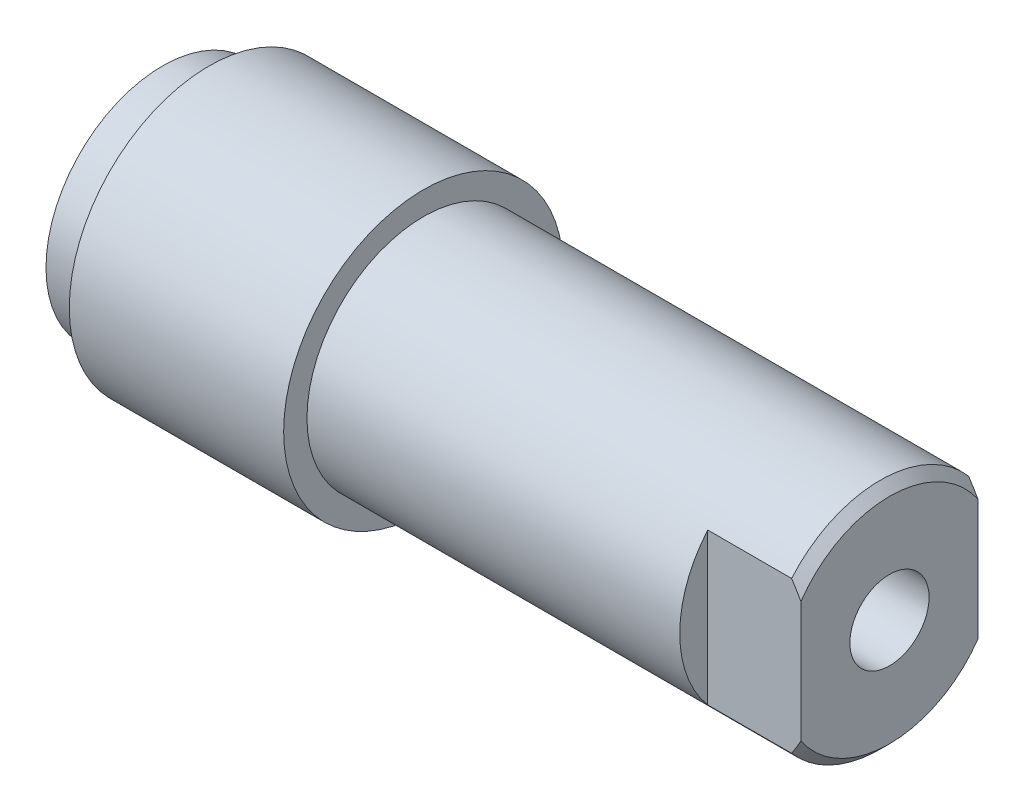
ISO-10303-21;
HEADER;
FILE_DESCRIPTION(('STEP AP214'),'2;1');
FILE_NAME('part.step','',(''),(''),'','','');
FILE_SCHEMA(('AUTOMOTIVE_DESIGN { 1 0 10303 214 1 1 1 1 }'));
ENDSEC;
DATA;
#1=APPLICATION_CONTEXT('core data for automotive mechanical design processes');
#2=APPLICATION_PROTOCOL_DEFINITION('international standard','automotive_design',2000,#1);
#3=PRODUCT_CONTEXT('',#1,'mechanical');
#4=PRODUCT('Part','Part','',(#3));
#5=PRODUCT_RELATED_PRODUCT_CATEGORY('part','',(#4));
#6=PRODUCT_DEFINITION_FORMATION('','',#4);
#7=PRODUCT_DEFINITION_CONTEXT('part definition',#1,'design');
#8=PRODUCT_DEFINITION('design','',#6,#7);
#9=PRODUCT_DEFINITION_SHAPE('','',#8);
#10=(LENGTH_UNIT() NAMED_UNIT(*) SI_UNIT(.MILLI.,.METRE.));
#11=(NAMED_UNIT(*) PLANE_ANGLE_UNIT() SI_UNIT($,.RADIAN.));
#12=(NAMED_UNIT(*) SI_UNIT($,.STERADIAN.) SOLID_ANGLE_UNIT());
#13=UNCERTAINTY_MEASURE_WITH_UNIT(LENGTH_MEASURE(1.E-05),#10,'distance_accuracy_value','');
#14=(GEOMETRIC_REPRESENTATION_CONTEXT(3) GLOBAL_UNCERTAINTY_ASSIGNED_CONTEXT((#13)) GLOBAL_UNIT_ASSIGNED_CONTEXT((#10,
#11,#12)) REPRESENTATION_CONTEXT('',''));
#15=CARTESIAN_POINT('',(0.,0.,0.));
#16=DIRECTION('',(0.,0.,1.));
#17=DIRECTION('',(1.,0.,0.));
#18=AXIS2_PLACEMENT_3D('',#15,#16,#17);
#19=CARTESIAN_POINT('',(0.,0.,0.));
#20=DIRECTION('',(-1.,0.,0.));
#21=DIRECTION('',(0.,0.,1.));
#22=AXIS2_PLACEMENT_3D('',#19,#20,#21);
#23=CONICAL_SURFACE('',#22,11.5,0.785398163397448);
#24=CARTESIAN_POINT('',(-1.,0.,0.));
#25=DIRECTION('',(-1.,0.,0.));
#26=DIRECTION('',(0.,0.,1.));
#27=AXIS2_PLACEMENT_3D('',#24,#25,#26);
#28=CIRCLE('',#27,12.5);
#29=CARTESIAN_POINT('',(-1.,-8.12403840463596,-9.5));
#30=VERTEX_POINT('',#29);
#31=CARTESIAN_POINT('',(-1.,-8.12403840463596,9.5));
#32=VERTEX_POINT('',#31);
#33=EDGE_CURVE('E112',#30,#32,#28,.T.);
#34=ORIENTED_EDGE('',*,*,#33,.F.);
#35=CARTESIAN_POINT('',(-1.0007,-8.12511541394952,-9.5));
#36=CARTESIAN_POINT('',(-0.873194561551899,-7.9289117454699,-9.5));
#37=CARTESIAN_POINT('',(-0.747526482821213,-7.73149513637505,-9.5));
#38=CARTESIAN_POINT('',(-0.500498397846567,-7.33391925222832,-9.5));
#39=CARTESIAN_POINT('',(-0.379139477254392,-7.13375930337704,-9.5));
#40=CARTESIAN_POINT('',(-0.140850162617151,-6.72949835661232,-9.5));
#41=CARTESIAN_POINT('',(-0.0239441445559193,-6.52538293756249,-9.5));
#42=CARTESIAN_POINT('',(0.203967032279799,-6.11389534110116,-9.5));
#43=CARTESIAN_POINT('',(0.314972569437841,-5.9065233736317,-9.5));
#44=CARTESIAN_POINT('',(0.532990035141959,-5.48262863158564,-9.5));
#45=CARTESIAN_POINT('',(0.639815908636657,-5.26600942041289,-9.5));
#46=CARTESIAN_POINT('',(0.844960390996271,-4.82878383550617,-9.5));
#47=CARTESIAN_POINT('',(0.943278188873506,-4.60817708409836,-9.5));
#48=CARTESIAN_POINT('',(1.22297714469007,-3.94082587123786,-9.5));
#49=CARTESIAN_POINT('',(1.38960707909409,-3.48759817726118,-9.5));
#50=CARTESIAN_POINT('',(1.61476461376648,-2.74577168286483,-9.5));
#51=CARTESIAN_POINT('',(1.69006843299933,-2.4622397074083,-9.5));
#52=CARTESIAN_POINT('',(1.81783779881872,-1.8899688668685,-9.5));
#53=CARTESIAN_POINT('',(1.87030280178218,-1.60122987801513,-9.5));
#54=CARTESIAN_POINT('',(1.94925725507413,-1.02351549135478,-9.5));
#55=CARTESIAN_POINT('',(1.97603480431458,-0.734579982475223,-9.5));
#56=CARTESIAN_POINT('',(2.00312967295379,-0.155467200349581,-9.5));
#57=CARTESIAN_POINT('',(2.00344879537636,0.134709986933968,-9.5));
#58=CARTESIAN_POINT('',(1.97760631301387,0.713974184103464,-9.5));
#59=CARTESIAN_POINT('',(1.95143452124533,1.00306073166355,-9.5));
#60=CARTESIAN_POINT('',(1.87407524049517,1.57784529406505,-9.5));
#61=CARTESIAN_POINT('',(1.82288492233312,1.86354292193241,-9.5));
#62=CARTESIAN_POINT('',(1.69735979754209,2.4330693054564,-9.5));
#63=CARTESIAN_POINT('',(1.62277429072305,2.71684207719332,-9.5));
#64=CARTESIAN_POINT('',(1.45381362758855,3.27835174619045,-9.5));
#65=CARTESIAN_POINT('',(1.3594384425099,3.55608863467719,-9.5));
#66=CARTESIAN_POINT('',(1.11305399733529,4.21494576392924,-9.5));
#67=CARTESIAN_POINT('',(0.95307743206747,4.59307278528129,-9.5));
#68=CARTESIAN_POINT('',(0.608063087445193,5.33792394680765,-9.5));
#69=CARTESIAN_POINT('',(0.423003285871534,5.70463771469682,-9.5));
#70=CARTESIAN_POINT('',(0.133584879777872,6.24238388513473,-9.5));
#71=CARTESIAN_POINT('',(0.0364760843111557,6.41737991981025,-9.5));
#72=CARTESIAN_POINT('',(-0.161741379517749,6.76510448092926,-9.5));
#73=CARTESIAN_POINT('',(-0.262850188715233,6.93783292724824,-9.5));
#74=CARTESIAN_POINT('',(-0.468327562542131,7.28077451221489,-9.5));
#75=CARTESIAN_POINT('',(-0.572687799992644,7.45099265718999,-9.5));
#76=CARTESIAN_POINT('',(-0.784483675728173,7.78947329111204,-9.5));
#77=CARTESIAN_POINT('',(-0.891918883394734,7.9577360492957,-9.5));
#78=CARTESIAN_POINT('',(-1.0007,8.12511541394952,-9.5));
#79=B_SPLINE_CURVE_WITH_KNOTS('',3,(#35,#36,#37,#38,#39,#40,#41,#42,#43,#44,#45,#46,#47,#48,#49,
#50,#51,#52,#53,#54,#55,#56,#57,#58,#59,#60,#61,#62,#63,#64,#65,#66,#67,#68,#69,#70,#71,#72,#73,
#74,#75,#76,#77,#78),.UNSPECIFIED.,.F.,.F.,(4,2,2,2,2,2,2,2,2,2,2,2,2,2,2,2,2,2,2,2,2,4),(0.,
0.701997094411312,1.40416981327412,2.10975345072377,2.81529178607948,3.53968867966653,
4.2641545467044,5.70986391983337,6.58918463340871,7.4685262759539,8.33788614686162,
9.20718677472175,10.0768218159843,10.9465552213102,11.8259467587553,12.7053395743565,
13.9358121923581,15.1673722065296,15.7677344465392,16.3681178433696,16.9670729311215,
17.5659445477606),.UNSPECIFIED.);
#80=CARTESIAN_POINT('',(0.,-6.48074069840786,-9.5));
#81=VERTEX_POINT('',#80);
#82=EDGE_CURVE('E164',#30,#81,#79,.T.);
#83=ORIENTED_EDGE('',*,*,#82,.T.);
#84=CARTESIAN_POINT('',(0.,0.,0.));
#85=DIRECTION('',(-1.,0.,0.));
#86=DIRECTION('',(0.,0.,1.));
#87=AXIS2_PLACEMENT_3D('',#84,#85,#86);
#88=CIRCLE('',#87,11.5);
#89=CARTESIAN_POINT('',(0.,-6.48074069840786,9.5));
#90=VERTEX_POINT('',#89);
#91=EDGE_CURVE('E113',#81,#90,#88,.T.);
#92=ORIENTED_EDGE('',*,*,#91,.T.);
#93=CARTESIAN_POINT('',(-1.0007,8.12511541394952,9.5));
#94=CARTESIAN_POINT('',(-0.873194561551899,7.9289117454699,9.5));
#95=CARTESIAN_POINT('',(-0.747526482821213,7.73149513637505,9.5));
#96=CARTESIAN_POINT('',(-0.500498397846567,7.33391925222832,9.5));
#97=CARTESIAN_POINT('',(-0.379139477254392,7.13375930337704,9.5));
#98=CARTESIAN_POINT('',(-0.140850162617151,6.72949835661232,9.5));
#99=CARTESIAN_POINT('',(-0.0239441445559193,6.52538293756249,9.5));
#100=CARTESIAN_POINT('',(0.203967032279799,6.11389534110116,9.5));
#101=CARTESIAN_POINT('',(0.314972569437841,5.9065233736317,9.5));
#102=CARTESIAN_POINT('',(0.532990035141959,5.48262863158564,9.5));
#103=CARTESIAN_POINT('',(0.639815908636657,5.26600942041289,9.5));
#104=CARTESIAN_POINT('',(0.844960390996271,4.82878383550617,9.5));
#105=CARTESIAN_POINT('',(0.943278188873506,4.60817708409836,9.5));
#106=CARTESIAN_POINT('',(1.22297714469007,3.94082587123786,9.5));
#107=CARTESIAN_POINT('',(1.38960707909409,3.48759817726118,9.5));
#108=CARTESIAN_POINT('',(1.61476461376648,2.74577168286483,9.5));
#109=CARTESIAN_POINT('',(1.69006843299933,2.4622397074083,9.5));
#110=CARTESIAN_POINT('',(1.81783779881872,1.8899688668685,9.5));
#111=CARTESIAN_POINT('',(1.87030280178218,1.60122987801513,9.5));
#112=CARTESIAN_POINT('',(1.94925725507413,1.02351549135478,9.5));
#113=CARTESIAN_POINT('',(1.97603480431458,0.734579982475223,9.5));
#114=CARTESIAN_POINT('',(2.00312967295379,0.155467200349581,9.5));
#115=CARTESIAN_POINT('',(2.00344879537636,-0.134709986933968,9.5));
#116=CARTESIAN_POINT('',(1.97760631301387,-0.713974184103464,9.5));
#117=CARTESIAN_POINT('',(1.95143452124533,-1.00306073166355,9.5));
#118=CARTESIAN_POINT('',(1.87407524049517,-1.57784529406505,9.5));
#119=CARTESIAN_POINT('',(1.82288492233312,-1.86354292193241,9.5));
#120=CARTESIAN_POINT('',(1.69735979754209,-2.4330693054564,9.5));
#121=CARTESIAN_POINT('',(1.62277429072305,-2.71684207719332,9.5));
#122=CARTESIAN_POINT('',(1.45381362758855,-3.27835174619045,9.5));
#123=CARTESIAN_POINT('',(1.3594384425099,-3.55608863467719,9.5));
#124=CARTESIAN_POINT('',(1.11305399733529,-4.21494576392924,9.5));
#125=CARTESIAN_POINT('',(0.95307743206747,-4.59307278528129,9.5));
#126=CARTESIAN_POINT('',(0.608063087445193,-5.33792394680765,9.5));
#127=CARTESIAN_POINT('',(0.423003285871534,-5.70463771469682,9.5));
#128=CARTESIAN_POINT('',(0.133584879777872,-6.24238388513473,9.5));
#129=CARTESIAN_POINT('',(0.0364760843111557,-6.41737991981025,9.5));
#130=CARTESIAN_POINT('',(-0.161741379517749,-6.76510448092926,9.5));
#131=CARTESIAN_POINT('',(-0.262850188715233,-6.93783292724824,9.5));
#132=CARTESIAN_POINT('',(-0.468327562542131,-7.28077451221489,9.5));
#133=CARTESIAN_POINT('',(-0.572687799992644,-7.45099265718999,9.5));
#134=CARTESIAN_POINT('',(-0.784483675728173,-7.78947329111204,9.5));
#135=CARTESIAN_POINT('',(-0.891918883394734,-7.9577360492957,9.5));
#136=CARTESIAN_POINT('',(-1.0007,-8.12511541394952,9.5));
#137=B_SPLINE_CURVE_WITH_KNOTS('',3,(#93,#94,#95,#96,#97,#98,#99,#100,#101,#102,#103,#104,#105,
#106,#107,#108,#109,#110,#111,#112,#113,#114,#115,#116,#117,#118,#119,#120,#121,#122,#123,#124,
#125,#126,#127,#128,#129,#130,#131,#132,#133,#134,#135,#136),.UNSPECIFIED.,.F.,.F.,(4,2,2,2,2,2,
2,2,2,2,2,2,2,2,2,2,2,2,2,2,2,4),(0.,0.701997094411312,1.40416981327412,2.10975345072377,
2.81529178607948,3.53968867966653,4.2641545467044,5.70986391983337,6.58918463340871,
7.4685262759539,8.33788614686162,9.20718677472175,10.0768218159843,10.9465552213102,
11.8259467587553,12.7053395743565,13.9358121923581,15.1673722065296,15.7677344465392,
16.3681178433696,16.9670729311215,17.5659445477606),.UNSPECIFIED.);
#138=EDGE_CURVE('E54',#90,#32,#137,.T.);
#139=ORIENTED_EDGE('',*,*,#138,.T.);
#140=EDGE_LOOP('',(#34,#83,#92,#139));
#141=FACE_BOUND('',#140,.T.);
#142=ADVANCED_FACE('F39',(#141),#23,.T.);
#143=CARTESIAN_POINT('',(-78.,0.,0.));
#144=DIRECTION('',(1.,0.,0.));
#145=DIRECTION('',(0.,0.,-1.));
#146=AXIS2_PLACEMENT_3D('',#143,#144,#145);
#147=PLANE('',#146);
#148=CARTESIAN_POINT('',(-78.,0.,0.));
#149=DIRECTION('',(-1.,0.,0.));
#150=DIRECTION('',(0.,0.,1.));
#151=AXIS2_PLACEMENT_3D('',#148,#149,#150);
#152=CIRCLE('',#151,12.5);
#153=CARTESIAN_POINT('',(-78.,0.,12.5));
#154=VERTEX_POINT('',#153);
#155=EDGE_CURVE('E99',#154,#154,#152,.T.);
#156=ORIENTED_EDGE('',*,*,#155,.T.);
#157=EDGE_LOOP('',(#156));
#158=FACE_BOUND('',#157,.T.);
#159=ADVANCED_FACE('F41',(#158),#147,.F.);
#160=CARTESIAN_POINT('',(-78.,0.,0.));
#161=DIRECTION('',(-1.,0.,0.));
#162=DIRECTION('',(0.,0.,1.));
#163=AXIS2_PLACEMENT_3D('',#160,#161,#162);
#164=CYLINDRICAL_SURFACE('',#163,12.5);
#165=ORIENTED_EDGE('',*,*,#155,.F.);
#166=EDGE_LOOP('',(#165));
#167=FACE_BOUND('',#166,.T.);
#168=CARTESIAN_POINT('',(-73.,0.,0.));
#169=DIRECTION('',(-1.,0.,0.));
#170=DIRECTION('',(0.,0.,1.));
#171=AXIS2_PLACEMENT_3D('',#168,#169,#170);
#172=CIRCLE('',#171,12.5);
#173=CARTESIAN_POINT('',(-73.,0.,12.5));
#174=VERTEX_POINT('',#173);
#175=EDGE_CURVE('E130',#174,#174,#172,.T.);
#176=ORIENTED_EDGE('',*,*,#175,.T.);
#177=EDGE_LOOP('',(#176));
#178=FACE_BOUND('',#177,.T.);
#179=ADVANCED_FACE('F190',(#167,#178),#164,.T.);
#180=CARTESIAN_POINT('',(-73.,12.5,0.));
#181=DIRECTION('',(1.,0.,0.));
#182=DIRECTION('',(0.,0.,-1.));
#183=AXIS2_PLACEMENT_3D('',#180,#181,#182);
#184=PLANE('',#183);
#185=ORIENTED_EDGE('',*,*,#175,.F.);
#186=EDGE_LOOP('',(#185));
#187=FACE_BOUND('',#186,.T.);
#188=CARTESIAN_POINT('',(-73.,0.,0.));
#189=DIRECTION('',(-1.,0.,0.));
#190=DIRECTION('',(0.,0.,1.));
#191=AXIS2_PLACEMENT_3D('',#188,#189,#190);
#192=CIRCLE('',#191,15.);
#193=CARTESIAN_POINT('',(-73.,0.,15.));
#194=VERTEX_POINT('',#193);
#195=EDGE_CURVE('E127',#194,#194,#192,.T.);
#196=ORIENTED_EDGE('',*,*,#195,.T.);
#197=EDGE_LOOP('',(#196));
#198=FACE_BOUND('',#197,.T.);
#199=ADVANCED_FACE('F296',(#187,#198),#184,.F.);
#200=CARTESIAN_POINT('',(-78.,0.,0.));
#201=DIRECTION('',(-1.,0.,0.));
#202=DIRECTION('',(0.,0.,1.));
#203=AXIS2_PLACEMENT_3D('',#200,#201,#202);
#204=CYLINDRICAL_SURFACE('',#203,15.);
#205=ORIENTED_EDGE('',*,*,#195,.F.);
#206=EDGE_LOOP('',(#205));
#207=FACE_BOUND('',#206,.T.);
#208=CARTESIAN_POINT('',(-50.,0.,0.));
#209=DIRECTION('',(-1.,0.,0.));
#210=DIRECTION('',(0.,0.,1.));
#211=AXIS2_PLACEMENT_3D('',#208,#209,#210);
#212=CIRCLE('',#211,15.);
#213=CARTESIAN_POINT('',(-50.,0.,15.));
#214=VERTEX_POINT('',#213);
#215=EDGE_CURVE('E124',#214,#214,#212,.T.);
#216=ORIENTED_EDGE('',*,*,#215,.T.);
#217=EDGE_LOOP('',(#216));
#218=FACE_BOUND('',#217,.T.);
#219=ADVANCED_FACE('F285',(#207,#218),#204,.T.);
#220=CARTESIAN_POINT('',(-50.,15.,0.));
#221=DIRECTION('',(-1.,0.,0.));
#222=DIRECTION('',(0.,0.,1.));
#223=AXIS2_PLACEMENT_3D('',#220,#221,#222);
#224=PLANE('',#223);
#225=ORIENTED_EDGE('',*,*,#215,.F.);
#226=EDGE_LOOP('',(#225));
#227=FACE_BOUND('',#226,.T.);
#228=CARTESIAN_POINT('',(-50.,0.,0.));
#229=DIRECTION('',(-1.,0.,0.));
#230=DIRECTION('',(0.,0.,1.));
#231=AXIS2_PLACEMENT_3D('',#228,#229,#230);
#232=CIRCLE('',#231,12.5);
#233=CARTESIAN_POINT('',(-50.,0.,12.5));
#234=VERTEX_POINT('',#233);
#235=EDGE_CURVE('E121',#234,#234,#232,.T.);
#236=ORIENTED_EDGE('',*,*,#235,.T.);
#237=EDGE_LOOP('',(#236));
#238=FACE_BOUND('',#237,.T.);
#239=ADVANCED_FACE('F272',(#227,#238),#224,.F.);
#240=CARTESIAN_POINT('',(-78.,0.,0.));
#241=DIRECTION('',(-1.,0.,0.));
#242=DIRECTION('',(0.,0.,1.));
#243=AXIS2_PLACEMENT_3D('',#240,#241,#242);
#244=CYLINDRICAL_SURFACE('',#243,12.5);
#245=CARTESIAN_POINT('',(-1.,8.12403840463596,9.5));
#246=VERTEX_POINT('',#245);
#247=CARTESIAN_POINT('',(-1.,8.12403840463596,-9.5));
#248=VERTEX_POINT('',#247);
#249=EDGE_CURVE('E107',#246,#248,#28,.T.);
#250=ORIENTED_EDGE('',*,*,#249,.T.);
#251=DIRECTION('',(-1.,0.,0.));
#252=VECTOR('',#251,1.);
#253=CARTESIAN_POINT('',(-78.,8.12403840463596,-9.5));
#254=LINE('',#253,#252);
#255=CARTESIAN_POINT('',(-9.99999999999999,8.12403840463596,-9.5));
#256=VERTEX_POINT('',#255);
#257=EDGE_CURVE('E163',#248,#256,#254,.T.);
#258=ORIENTED_EDGE('',*,*,#257,.T.);
#259=CARTESIAN_POINT('',(-9.99999999999999,0.,0.));
#260=DIRECTION('',(1.,0.,0.));
#261=DIRECTION('',(0.,0.,-1.));
#262=AXIS2_PLACEMENT_3D('',#259,#260,#261);
#263=CIRCLE('',#262,12.5);
#264=CARTESIAN_POINT('',(-9.99999999999999,-8.12403840463596,-9.5));
#265=VERTEX_POINT('',#264);
#266=EDGE_CURVE('E11',#265,#256,#263,.T.);
#267=ORIENTED_EDGE('',*,*,#266,.F.);
#268=DIRECTION('',(-1.,0.,0.));
#269=VECTOR('',#268,1.);
#270=CARTESIAN_POINT('',(-78.,-8.12403840463596,-9.5));
#271=LINE('',#270,#269);
#272=EDGE_CURVE('E117',#265,#30,#271,.F.);
#273=ORIENTED_EDGE('',*,*,#272,.T.);
#274=ORIENTED_EDGE('',*,*,#33,.T.);
#275=DIRECTION('',(-1.,0.,0.));
#276=VECTOR('',#275,1.);
#277=CARTESIAN_POINT('',(-78.,-8.12403840463596,9.5));
#278=LINE('',#277,#276);
#279=CARTESIAN_POINT('',(-9.99999999999999,-8.12403840463596,9.5));
#280=VERTEX_POINT('',#279);
#281=EDGE_CURVE('E109',#32,#280,#278,.T.);
#282=ORIENTED_EDGE('',*,*,#281,.T.);
#283=CARTESIAN_POINT('',(-9.99999999999999,0.,0.));
#284=DIRECTION('',(1.,0.,0.));
#285=DIRECTION('',(0.,0.,-1.));
#286=AXIS2_PLACEMENT_3D('',#283,#284,#285);
#287=CIRCLE('',#286,12.5);
#288=CARTESIAN_POINT('',(-9.99999999999999,8.12403840463596,9.5));
#289=VERTEX_POINT('',#288);
#290=EDGE_CURVE('E47',#289,#280,#287,.T.);
#291=ORIENTED_EDGE('',*,*,#290,.F.);
#292=DIRECTION('',(-1.,0.,0.));
#293=VECTOR('',#292,1.);
#294=CARTESIAN_POINT('',(-78.,8.12403840463596,9.5));
#295=LINE('',#294,#293);
#296=EDGE_CURVE('E108',#289,#246,#295,.F.);
#297=ORIENTED_EDGE('',*,*,#296,.T.);
#298=EDGE_LOOP('',(#250,#258,#267,#273,#274,#282,#291,#297));
#299=FACE_BOUND('',#298,.T.);
#300=ORIENTED_EDGE('',*,*,#235,.F.);
#301=EDGE_LOOP('',(#300));
#302=FACE_BOUND('',#301,.T.);
#303=ADVANCED_FACE('F145',(#299,#302),#244,.T.);
#304=CARTESIAN_POINT('',(0.,6.48074069840786,9.5));
#305=VERTEX_POINT('',#304);
#306=CARTESIAN_POINT('',(0.,6.48074069840786,-9.5));
#307=VERTEX_POINT('',#306);
#308=EDGE_CURVE('E105',#305,#307,#88,.T.);
#309=ORIENTED_EDGE('',*,*,#308,.T.);
#310=EDGE_CURVE('E62',#307,#248,#79,.T.);
#311=ORIENTED_EDGE('',*,*,#310,.T.);
#312=ORIENTED_EDGE('',*,*,#249,.F.);
#313=EDGE_CURVE('E92',#246,#305,#137,.T.);
#314=ORIENTED_EDGE('',*,*,#313,.T.);
#315=EDGE_LOOP('',(#309,#311,#312,#314));
#316=FACE_BOUND('',#315,.T.);
#317=ADVANCED_FACE('F104',(#316),#23,.T.);
#318=CARTESIAN_POINT('',(0.,11.5,0.));
#319=DIRECTION('',(-1.,0.,0.));
#320=DIRECTION('',(0.,0.,1.));
#321=AXIS2_PLACEMENT_3D('',#318,#319,#320);
#322=PLANE('',#321);
#323=CARTESIAN_POINT('',(0.,0.,0.));
#324=DIRECTION('',(1.,0.,0.));
#325=DIRECTION('',(0.,0.,-1.));
#326=AXIS2_PLACEMENT_3D('',#323,#324,#325);
#327=CIRCLE('',#326,4.25);
#328=CARTESIAN_POINT('',(0.,0.,-4.25));
#329=VERTEX_POINT('',#328);
#330=EDGE_CURVE('E200',#329,#329,#327,.T.);
#331=ORIENTED_EDGE('',*,*,#330,.F.);
#332=EDGE_LOOP('',(#331));
#333=FACE_BOUND('',#332,.T.);
#334=ORIENTED_EDGE('',*,*,#91,.F.);
#335=DIRECTION('',(0.,1.,0.));
#336=VECTOR('',#335,1.);
#337=CARTESIAN_POINT('',(0.,11.5,-9.5));
#338=LINE('',#337,#336);
#339=EDGE_CURVE('E98',#81,#307,#338,.T.);
#340=ORIENTED_EDGE('',*,*,#339,.T.);
#341=ORIENTED_EDGE('',*,*,#308,.F.);
#342=DIRECTION('',(0.,-1.,0.));
#343=VECTOR('',#342,1.);
#344=CARTESIAN_POINT('',(0.,11.5,9.5));
#345=LINE('',#344,#343);
#346=EDGE_CURVE('E88',#305,#90,#345,.T.);
#347=ORIENTED_EDGE('',*,*,#346,.T.);
#348=EDGE_LOOP('',(#334,#340,#341,#347));
#349=FACE_BOUND('',#348,.T.);
#350=ADVANCED_FACE('F111',(#333,#349),#322,.F.);
#351=CARTESIAN_POINT('',(-10.,0.,0.));
#352=DIRECTION('',(1.,0.,0.));
#353=DIRECTION('',(0.,0.,-1.));
#354=AXIS2_PLACEMENT_3D('',#351,#352,#353);
#355=PLANE('',#354);
#356=ORIENTED_EDGE('',*,*,#290,.T.);
#357=DIRECTION('',(0.,1.,0.));
#358=VECTOR('',#357,1.);
#359=CARTESIAN_POINT('',(-10.,-14.,9.5));
#360=LINE('',#359,#358);
#361=EDGE_CURVE('E139',#280,#289,#360,.T.);
#362=ORIENTED_EDGE('',*,*,#361,.T.);
#363=EDGE_LOOP('',(#356,#362));
#364=FACE_BOUND('',#363,.T.);
#365=ADVANCED_FACE('F138',(#364),#355,.T.);
#366=CARTESIAN_POINT('',(-10.,-14.,9.5));
#367=DIRECTION('',(0.,0.,-1.));
#368=DIRECTION('',(-1.,0.,0.));
#369=AXIS2_PLACEMENT_3D('',#366,#367,#368);
#370=PLANE('',#369);
#371=ORIENTED_EDGE('',*,*,#361,.F.);
#372=ORIENTED_EDGE('',*,*,#281,.F.);
#373=ORIENTED_EDGE('',*,*,#138,.F.);
#374=ORIENTED_EDGE('',*,*,#346,.F.);
#375=ORIENTED_EDGE('',*,*,#313,.F.);
#376=ORIENTED_EDGE('',*,*,#296,.F.);
#377=EDGE_LOOP('',(#371,#372,#373,#374,#375,#376));
#378=FACE_BOUND('',#377,.T.);
#379=ADVANCED_FACE('F91',(#378),#370,.F.);
#380=CARTESIAN_POINT('',(-10.,0.,0.));
#381=DIRECTION('',(1.,0.,0.));
#382=DIRECTION('',(0.,0.,-1.));
#383=AXIS2_PLACEMENT_3D('',#380,#381,#382);
#384=PLANE('',#383);
#385=ORIENTED_EDGE('',*,*,#266,.T.);
#386=DIRECTION('',(0.,-1.,0.));
#387=VECTOR('',#386,1.);
#388=CARTESIAN_POINT('',(-10.,14.,-9.5));
#389=LINE('',#388,#387);
#390=EDGE_CURVE('E142',#256,#265,#389,.T.);
#391=ORIENTED_EDGE('',*,*,#390,.T.);
#392=EDGE_LOOP('',(#385,#391));
#393=FACE_BOUND('',#392,.T.);
#394=ADVANCED_FACE('F173',(#393),#384,.T.);
#395=CARTESIAN_POINT('',(-10.,14.,-9.5));
#396=DIRECTION('',(0.,0.,1.));
#397=DIRECTION('',(1.,0.,0.));
#398=AXIS2_PLACEMENT_3D('',#395,#396,#397);
#399=PLANE('',#398);
#400=ORIENTED_EDGE('',*,*,#390,.F.);
#401=ORIENTED_EDGE('',*,*,#257,.F.);
#402=ORIENTED_EDGE('',*,*,#310,.F.);
#403=ORIENTED_EDGE('',*,*,#339,.F.);
#404=ORIENTED_EDGE('',*,*,#82,.F.);
#405=ORIENTED_EDGE('',*,*,#272,.F.);
#406=EDGE_LOOP('',(#400,#401,#402,#403,#404,#405));
#407=FACE_BOUND('',#406,.T.);
#408=ADVANCED_FACE('F168',(#407),#399,.F.);
#409=CARTESIAN_POINT('',(-20.,0.,0.));
#410=DIRECTION('',(1.,0.,0.));
#411=DIRECTION('',(0.,0.,-1.));
#412=AXIS2_PLACEMENT_3D('',#409,#410,#411);
#413=CYLINDRICAL_SURFACE('',#412,4.25);
#414=CARTESIAN_POINT('',(-20.,0.,0.));
#415=DIRECTION('',(1.,0.,0.));
#416=DIRECTION('',(0.,0.,-1.));
#417=AXIS2_PLACEMENT_3D('',#414,#415,#416);
#418=CIRCLE('',#417,4.25);
#419=CARTESIAN_POINT('',(-20.,0.,-4.25));
#420=VERTEX_POINT('',#419);
#421=EDGE_CURVE('E143',#420,#420,#418,.T.);
#422=ORIENTED_EDGE('',*,*,#421,.F.);
#423=EDGE_LOOP('',(#422));
#424=FACE_BOUND('',#423,.T.);
#425=ORIENTED_EDGE('',*,*,#330,.T.);
#426=EDGE_LOOP('',(#425));
#427=FACE_BOUND('',#426,.T.);
#428=ADVANCED_FACE('F172',(#424,#427),#413,.F.);
#429=CARTESIAN_POINT('',(-20.,0.,0.));
#430=DIRECTION('',(1.,0.,0.));
#431=DIRECTION('',(0.,0.,-1.));
#432=AXIS2_PLACEMENT_3D('',#429,#430,#431);
#433=PLANE('',#432);
#434=ORIENTED_EDGE('',*,*,#421,.T.);
#435=EDGE_LOOP('',(#434));
#436=FACE_BOUND('',#435,.T.);
#437=ADVANCED_FACE('F206',(#436),#433,.T.);
#438=CLOSED_SHELL('',(#142,#159,#179,#199,#219,#239,#303,#317,#350,#365,#379,#394,#408,#428,#437));
#439=MANIFOLD_SOLID_BREP('B2',#438);
#440=ADVANCED_BREP_SHAPE_REPRESENTATION('',(#18,#439),#14);
#441=SHAPE_DEFINITION_REPRESENTATION(#9,#440);
ENDSEC;
END-ISO-10303-21;
